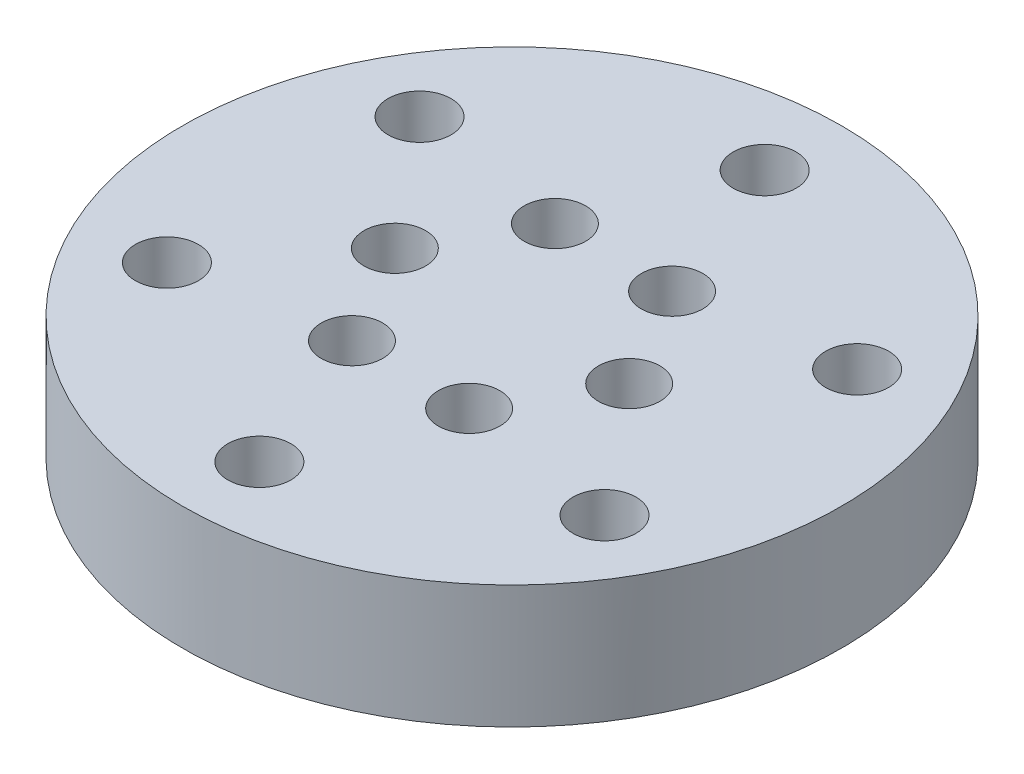
ISO-10303-21;
HEADER;
FILE_DESCRIPTION(('STEP AP214'),'2;1');
FILE_NAME('part.step','',(''),(''),'','','');
FILE_SCHEMA(('AUTOMOTIVE_DESIGN { 1 0 10303 214 1 1 1 1 }'));
ENDSEC;
DATA;
#1=APPLICATION_CONTEXT('core data for automotive mechanical design processes');
#2=APPLICATION_PROTOCOL_DEFINITION('international standard','automotive_design',2000,#1);
#3=PRODUCT_CONTEXT('',#1,'mechanical');
#4=PRODUCT('Part','Part','',(#3));
#5=PRODUCT_RELATED_PRODUCT_CATEGORY('part','',(#4));
#6=PRODUCT_DEFINITION_FORMATION('','',#4);
#7=PRODUCT_DEFINITION_CONTEXT('part definition',#1,'design');
#8=PRODUCT_DEFINITION('design','',#6,#7);
#9=PRODUCT_DEFINITION_SHAPE('','',#8);
#10=(LENGTH_UNIT() NAMED_UNIT(*) SI_UNIT(.MILLI.,.METRE.));
#11=(NAMED_UNIT(*) PLANE_ANGLE_UNIT() SI_UNIT($,.RADIAN.));
#12=(NAMED_UNIT(*) SI_UNIT($,.STERADIAN.) SOLID_ANGLE_UNIT());
#13=UNCERTAINTY_MEASURE_WITH_UNIT(LENGTH_MEASURE(1.E-05),#10,'distance_accuracy_value','');
#14=(GEOMETRIC_REPRESENTATION_CONTEXT(3) GLOBAL_UNCERTAINTY_ASSIGNED_CONTEXT((#13)) GLOBAL_UNIT_ASSIGNED_CONTEXT((#10,
#11,#12)) REPRESENTATION_CONTEXT('',''));
#15=CARTESIAN_POINT('',(0.,0.,0.));
#16=DIRECTION('',(0.,0.,1.));
#17=DIRECTION('',(1.,0.,0.));
#18=AXIS2_PLACEMENT_3D('',#15,#16,#17);
#19=CARTESIAN_POINT('',(0.,10.4,0.));
#20=DIRECTION('',(0.,-1.,0.));
#21=DIRECTION('',(0.,0.,-1.));
#22=AXIS2_PLACEMENT_3D('',#19,#20,#21);
#23=CYLINDRICAL_SURFACE('',#22,22.5);
#24=CARTESIAN_POINT('',(0.,10.4,0.));
#25=DIRECTION('',(0.,1.,0.));
#26=DIRECTION('',(0.,0.,1.));
#27=AXIS2_PLACEMENT_3D('',#24,#25,#26);
#28=CIRCLE('',#27,22.5);
#29=CARTESIAN_POINT('',(0.,10.4,22.5));
#30=VERTEX_POINT('',#29);
#31=EDGE_CURVE('E10',#30,#30,#28,.T.);
#32=ORIENTED_EDGE('',*,*,#31,.F.);
#33=EDGE_LOOP('',(#32));
#34=FACE_BOUND('',#33,.T.);
#35=CARTESIAN_POINT('',(0.,2.,0.));
#36=DIRECTION('',(0.,-1.,0.));
#37=DIRECTION('',(0.,0.,-1.));
#38=AXIS2_PLACEMENT_3D('',#35,#36,#37);
#39=CIRCLE('',#38,22.5);
#40=CARTESIAN_POINT('',(0.,2.,-22.5));
#41=VERTEX_POINT('',#40);
#42=EDGE_CURVE('E154',#41,#41,#39,.T.);
#43=ORIENTED_EDGE('',*,*,#42,.F.);
#44=EDGE_LOOP('',(#43));
#45=FACE_BOUND('',#44,.T.);
#46=ADVANCED_FACE('F39',(#34,#45),#23,.T.);
#47=CARTESIAN_POINT('',(-14.9389382152816,5.,-8.62499999999986));
#48=DIRECTION('',(0.,-1.,0.));
#49=DIRECTION('',(0.,0.,-1.));
#50=AXIS2_PLACEMENT_3D('',#47,#48,#49);
#51=CYLINDRICAL_SURFACE('',#50,4.);
#52=CARTESIAN_POINT('',(-14.9389382152816,5.,-8.62499999999986));
#53=DIRECTION('',(0.,-1.,0.));
#54=DIRECTION('',(0.,0.,-1.));
#55=AXIS2_PLACEMENT_3D('',#52,#53,#54);
#56=CIRCLE('',#55,4.);
#57=CARTESIAN_POINT('',(-14.9389382152816,5.,-12.6249999999999));
#58=VERTEX_POINT('',#57);
#59=EDGE_CURVE('E72',#58,#58,#56,.T.);
#60=ORIENTED_EDGE('',*,*,#59,.F.);
#61=EDGE_LOOP('',(#60));
#62=FACE_BOUND('',#61,.T.);
#63=CARTESIAN_POINT('',(-14.9389382152816,2.,-8.62499999999986));
#64=DIRECTION('',(0.,-1.,0.));
#65=DIRECTION('',(0.,0.,-1.));
#66=AXIS2_PLACEMENT_3D('',#63,#64,#65);
#67=CIRCLE('',#66,4.);
#68=CARTESIAN_POINT('',(-14.9389382152816,2.,-12.6249999999999));
#69=VERTEX_POINT('',#68);
#70=EDGE_CURVE('E121',#69,#69,#67,.F.);
#71=ORIENTED_EDGE('',*,*,#70,.F.);
#72=EDGE_LOOP('',(#71));
#73=FACE_BOUND('',#72,.T.);
#74=ADVANCED_FACE('F184',(#62,#73),#51,.F.);
#75=CARTESIAN_POINT('',(-14.9389382152815,5.,8.62500000000017));
#76=DIRECTION('',(0.,-1.,0.));
#77=DIRECTION('',(0.,0.,-1.));
#78=AXIS2_PLACEMENT_3D('',#75,#76,#77);
#79=CYLINDRICAL_SURFACE('',#78,4.);
#80=CARTESIAN_POINT('',(-14.9389382152815,5.,8.62500000000017));
#81=DIRECTION('',(0.,-1.,0.));
#82=DIRECTION('',(0.,0.,-1.));
#83=AXIS2_PLACEMENT_3D('',#80,#81,#82);
#84=CIRCLE('',#83,4.);
#85=CARTESIAN_POINT('',(-14.9389382152815,5.,4.62500000000017));
#86=VERTEX_POINT('',#85);
#87=EDGE_CURVE('E96',#86,#86,#84,.T.);
#88=ORIENTED_EDGE('',*,*,#87,.F.);
#89=EDGE_LOOP('',(#88));
#90=FACE_BOUND('',#89,.T.);
#91=CARTESIAN_POINT('',(-14.9389382152815,2.,8.62500000000017));
#92=DIRECTION('',(0.,-1.,0.));
#93=DIRECTION('',(0.,0.,-1.));
#94=AXIS2_PLACEMENT_3D('',#91,#92,#93);
#95=CIRCLE('',#94,4.);
#96=CARTESIAN_POINT('',(-14.9389382152815,2.,4.62500000000017));
#97=VERTEX_POINT('',#96);
#98=EDGE_CURVE('E124',#97,#97,#95,.F.);
#99=ORIENTED_EDGE('',*,*,#98,.F.);
#100=EDGE_LOOP('',(#99));
#101=FACE_BOUND('',#100,.T.);
#102=ADVANCED_FACE('F190',(#90,#101),#79,.F.);
#103=CARTESIAN_POINT('',(0.,5.,17.25));
#104=DIRECTION('',(0.,-1.,0.));
#105=DIRECTION('',(0.,0.,-1.));
#106=AXIS2_PLACEMENT_3D('',#103,#104,#105);
#107=CYLINDRICAL_SURFACE('',#106,4.);
#108=CARTESIAN_POINT('',(0.,5.,17.25));
#109=DIRECTION('',(0.,-1.,0.));
#110=DIRECTION('',(0.,0.,-1.));
#111=AXIS2_PLACEMENT_3D('',#108,#109,#110);
#112=CIRCLE('',#111,4.);
#113=CARTESIAN_POINT('',(0.,5.,13.25));
#114=VERTEX_POINT('',#113);
#115=EDGE_CURVE('E67',#114,#114,#112,.T.);
#116=ORIENTED_EDGE('',*,*,#115,.F.);
#117=EDGE_LOOP('',(#116));
#118=FACE_BOUND('',#117,.T.);
#119=CARTESIAN_POINT('',(0.,2.,17.25));
#120=DIRECTION('',(0.,-1.,0.));
#121=DIRECTION('',(0.,0.,-1.));
#122=AXIS2_PLACEMENT_3D('',#119,#120,#121);
#123=CIRCLE('',#122,4.);
#124=CARTESIAN_POINT('',(0.,2.,13.25));
#125=VERTEX_POINT('',#124);
#126=EDGE_CURVE('E127',#125,#125,#123,.F.);
#127=ORIENTED_EDGE('',*,*,#126,.F.);
#128=EDGE_LOOP('',(#127));
#129=FACE_BOUND('',#128,.T.);
#130=ADVANCED_FACE('F197',(#118,#129),#107,.F.);
#131=CARTESIAN_POINT('',(14.9389382152816,5.,8.62499999999999));
#132=DIRECTION('',(0.,-1.,0.));
#133=DIRECTION('',(0.,0.,-1.));
#134=AXIS2_PLACEMENT_3D('',#131,#132,#133);
#135=CYLINDRICAL_SURFACE('',#134,4.00000000000003);
#136=CARTESIAN_POINT('',(14.9389382152816,5.,8.62499999999999));
#137=DIRECTION('',(0.,-1.,0.));
#138=DIRECTION('',(0.,0.,-1.));
#139=AXIS2_PLACEMENT_3D('',#136,#137,#138);
#140=CIRCLE('',#139,4.00000000000003);
#141=CARTESIAN_POINT('',(14.9389382152816,5.,4.62499999999996));
#142=VERTEX_POINT('',#141);
#143=EDGE_CURVE('E85',#142,#142,#140,.T.);
#144=ORIENTED_EDGE('',*,*,#143,.F.);
#145=EDGE_LOOP('',(#144));
#146=FACE_BOUND('',#145,.T.);
#147=CARTESIAN_POINT('',(14.9389382152816,2.,8.62499999999999));
#148=DIRECTION('',(0.,-1.,0.));
#149=DIRECTION('',(0.,0.,-1.));
#150=AXIS2_PLACEMENT_3D('',#147,#148,#149);
#151=CIRCLE('',#150,4.00000000000003);
#152=CARTESIAN_POINT('',(14.9389382152816,2.,4.62499999999996));
#153=VERTEX_POINT('',#152);
#154=EDGE_CURVE('E130',#153,#153,#151,.F.);
#155=ORIENTED_EDGE('',*,*,#154,.F.);
#156=EDGE_LOOP('',(#155));
#157=FACE_BOUND('',#156,.T.);
#158=ADVANCED_FACE('F271',(#146,#157),#135,.F.);
#159=CARTESIAN_POINT('',(14.9389382152815,5.,-8.62500000000007));
#160=DIRECTION('',(0.,-1.,0.));
#161=DIRECTION('',(0.,0.,-1.));
#162=AXIS2_PLACEMENT_3D('',#159,#160,#161);
#163=CYLINDRICAL_SURFACE('',#162,4.);
#164=CARTESIAN_POINT('',(14.9389382152815,5.,-8.62500000000007));
#165=DIRECTION('',(0.,-1.,0.));
#166=DIRECTION('',(0.,0.,-1.));
#167=AXIS2_PLACEMENT_3D('',#164,#165,#166);
#168=CIRCLE('',#167,4.);
#169=CARTESIAN_POINT('',(14.9389382152815,5.,-12.6250000000001));
#170=VERTEX_POINT('',#169);
#171=EDGE_CURVE('E79',#170,#170,#168,.T.);
#172=ORIENTED_EDGE('',*,*,#171,.F.);
#173=EDGE_LOOP('',(#172));
#174=FACE_BOUND('',#173,.T.);
#175=CARTESIAN_POINT('',(14.9389382152815,2.,-8.62500000000007));
#176=DIRECTION('',(0.,-1.,0.));
#177=DIRECTION('',(0.,0.,-1.));
#178=AXIS2_PLACEMENT_3D('',#175,#176,#177);
#179=CIRCLE('',#178,4.);
#180=CARTESIAN_POINT('',(14.9389382152815,2.,-12.6250000000001));
#181=VERTEX_POINT('',#180);
#182=EDGE_CURVE('E133',#181,#181,#179,.F.);
#183=ORIENTED_EDGE('',*,*,#182,.F.);
#184=EDGE_LOOP('',(#183));
#185=FACE_BOUND('',#184,.T.);
#186=ADVANCED_FACE('F312',(#174,#185),#163,.F.);
#187=CARTESIAN_POINT('',(-1.22190829666065E-13,5.,-17.25));
#188=DIRECTION('',(0.,-1.,0.));
#189=DIRECTION('',(0.,0.,-1.));
#190=AXIS2_PLACEMENT_3D('',#187,#188,#189);
#191=CYLINDRICAL_SURFACE('',#190,4.);
#192=CARTESIAN_POINT('',(-1.22190829666065E-13,5.,-17.25));
#193=DIRECTION('',(0.,-1.,0.));
#194=DIRECTION('',(0.,0.,-1.));
#195=AXIS2_PLACEMENT_3D('',#192,#193,#194);
#196=CIRCLE('',#195,4.);
#197=CARTESIAN_POINT('',(-1.22190829666065E-13,5.,-21.25));
#198=VERTEX_POINT('',#197);
#199=EDGE_CURVE('E71',#198,#198,#196,.T.);
#200=ORIENTED_EDGE('',*,*,#199,.F.);
#201=EDGE_LOOP('',(#200));
#202=FACE_BOUND('',#201,.T.);
#203=CARTESIAN_POINT('',(-1.22190829666065E-13,2.,-17.25));
#204=DIRECTION('',(0.,-1.,0.));
#205=DIRECTION('',(0.,0.,-1.));
#206=AXIS2_PLACEMENT_3D('',#203,#204,#205);
#207=CIRCLE('',#206,4.);
#208=CARTESIAN_POINT('',(-1.22190829666065E-13,2.,-21.25));
#209=VERTEX_POINT('',#208);
#210=EDGE_CURVE('E136',#209,#209,#207,.F.);
#211=ORIENTED_EDGE('',*,*,#210,.F.);
#212=EDGE_LOOP('',(#211));
#213=FACE_BOUND('',#212,.T.);
#214=ADVANCED_FACE('F296',(#202,#213),#191,.F.);
#215=CARTESIAN_POINT('',(8.,10.4,0.));
#216=DIRECTION('',(0.,-1.,0.));
#217=DIRECTION('',(0.,0.,-1.));
#218=AXIS2_PLACEMENT_3D('',#215,#216,#217);
#219=CYLINDRICAL_SURFACE('',#218,2.1);
#220=CARTESIAN_POINT('',(8.,10.4,0.));
#221=DIRECTION('',(0.,-1.,0.));
#222=DIRECTION('',(0.,0.,-1.));
#223=AXIS2_PLACEMENT_3D('',#220,#221,#222);
#224=CIRCLE('',#223,2.1);
#225=CARTESIAN_POINT('',(8.,10.4,-2.10000000000001));
#226=VERTEX_POINT('',#225);
#227=EDGE_CURVE('E99',#226,#226,#224,.T.);
#228=ORIENTED_EDGE('',*,*,#227,.F.);
#229=EDGE_LOOP('',(#228));
#230=FACE_BOUND('',#229,.T.);
#231=CARTESIAN_POINT('',(8.,2.,0.));
#232=DIRECTION('',(0.,-1.,0.));
#233=DIRECTION('',(0.,0.,-1.));
#234=AXIS2_PLACEMENT_3D('',#231,#232,#233);
#235=CIRCLE('',#234,2.1);
#236=CARTESIAN_POINT('',(8.,2.,-2.10000000000001));
#237=VERTEX_POINT('',#236);
#238=EDGE_CURVE('E139',#237,#237,#235,.F.);
#239=ORIENTED_EDGE('',*,*,#238,.F.);
#240=EDGE_LOOP('',(#239));
#241=FACE_BOUND('',#240,.T.);
#242=ADVANCED_FACE('F288',(#230,#241),#219,.F.);
#243=CARTESIAN_POINT('',(3.99999999999999,10.4,-6.92820323027551));
#244=DIRECTION('',(0.,-1.,0.));
#245=DIRECTION('',(0.,0.,-1.));
#246=AXIS2_PLACEMENT_3D('',#243,#244,#245);
#247=CYLINDRICAL_SURFACE('',#246,2.1);
#248=CARTESIAN_POINT('',(3.99999999999999,10.4,-6.92820323027551));
#249=DIRECTION('',(0.,-1.,0.));
#250=DIRECTION('',(0.,0.,-1.));
#251=AXIS2_PLACEMENT_3D('',#248,#249,#250);
#252=CIRCLE('',#251,2.1);
#253=CARTESIAN_POINT('',(3.99999999999999,10.4,-9.02820323027551));
#254=VERTEX_POINT('',#253);
#255=EDGE_CURVE('E111',#254,#254,#252,.T.);
#256=ORIENTED_EDGE('',*,*,#255,.F.);
#257=EDGE_LOOP('',(#256));
#258=FACE_BOUND('',#257,.T.);
#259=CARTESIAN_POINT('',(3.99999999999999,2.,-6.92820323027551));
#260=DIRECTION('',(0.,-1.,0.));
#261=DIRECTION('',(0.,0.,-1.));
#262=AXIS2_PLACEMENT_3D('',#259,#260,#261);
#263=CIRCLE('',#262,2.1);
#264=CARTESIAN_POINT('',(3.99999999999999,2.,-9.02820323027551));
#265=VERTEX_POINT('',#264);
#266=EDGE_CURVE('E142',#265,#265,#263,.F.);
#267=ORIENTED_EDGE('',*,*,#266,.F.);
#268=EDGE_LOOP('',(#267));
#269=FACE_BOUND('',#268,.T.);
#270=ADVANCED_FACE('F285',(#258,#269),#247,.F.);
#271=CARTESIAN_POINT('',(-4.00000000000001,10.4,-6.9282032302755));
#272=DIRECTION('',(0.,-1.,0.));
#273=DIRECTION('',(0.,0.,-1.));
#274=AXIS2_PLACEMENT_3D('',#271,#272,#273);
#275=CYLINDRICAL_SURFACE('',#274,2.1);
#276=CARTESIAN_POINT('',(-4.00000000000001,10.4,-6.9282032302755));
#277=DIRECTION('',(0.,-1.,0.));
#278=DIRECTION('',(0.,0.,-1.));
#279=AXIS2_PLACEMENT_3D('',#276,#277,#278);
#280=CIRCLE('',#279,2.1);
#281=CARTESIAN_POINT('',(-4.00000000000001,10.4,-9.0282032302755));
#282=VERTEX_POINT('',#281);
#283=EDGE_CURVE('E107',#282,#282,#280,.T.);
#284=ORIENTED_EDGE('',*,*,#283,.F.);
#285=EDGE_LOOP('',(#284));
#286=FACE_BOUND('',#285,.T.);
#287=CARTESIAN_POINT('',(-4.00000000000001,2.,-6.9282032302755));
#288=DIRECTION('',(0.,-1.,0.));
#289=DIRECTION('',(0.,0.,-1.));
#290=AXIS2_PLACEMENT_3D('',#287,#288,#289);
#291=CIRCLE('',#290,2.1);
#292=CARTESIAN_POINT('',(-4.00000000000001,2.,-9.0282032302755));
#293=VERTEX_POINT('',#292);
#294=EDGE_CURVE('E145',#293,#293,#291,.F.);
#295=ORIENTED_EDGE('',*,*,#294,.F.);
#296=EDGE_LOOP('',(#295));
#297=FACE_BOUND('',#296,.T.);
#298=ADVANCED_FACE('F287',(#286,#297),#275,.F.);
#299=CARTESIAN_POINT('',(-8.,10.4,0.));
#300=DIRECTION('',(0.,-1.,0.));
#301=DIRECTION('',(0.,0.,-1.));
#302=AXIS2_PLACEMENT_3D('',#299,#300,#301);
#303=CYLINDRICAL_SURFACE('',#302,2.1);
#304=CARTESIAN_POINT('',(-8.,10.4,0.));
#305=DIRECTION('',(0.,-1.,0.));
#306=DIRECTION('',(0.,0.,-1.));
#307=AXIS2_PLACEMENT_3D('',#304,#305,#306);
#308=CIRCLE('',#307,2.1);
#309=CARTESIAN_POINT('',(-8.,10.4,-2.09999999999999));
#310=VERTEX_POINT('',#309);
#311=EDGE_CURVE('E110',#310,#310,#308,.T.);
#312=ORIENTED_EDGE('',*,*,#311,.F.);
#313=EDGE_LOOP('',(#312));
#314=FACE_BOUND('',#313,.T.);
#315=CARTESIAN_POINT('',(-8.,2.,0.));
#316=DIRECTION('',(0.,-1.,0.));
#317=DIRECTION('',(0.,0.,-1.));
#318=AXIS2_PLACEMENT_3D('',#315,#316,#317);
#319=CIRCLE('',#318,2.1);
#320=CARTESIAN_POINT('',(-8.,2.,-2.09999999999999));
#321=VERTEX_POINT('',#320);
#322=EDGE_CURVE('E148',#321,#321,#319,.F.);
#323=ORIENTED_EDGE('',*,*,#322,.F.);
#324=EDGE_LOOP('',(#323));
#325=FACE_BOUND('',#324,.T.);
#326=ADVANCED_FACE('F178',(#314,#325),#303,.F.);
#327=CARTESIAN_POINT('',(-3.99999999999999,10.4,6.92820323027551));
#328=DIRECTION('',(0.,-1.,0.));
#329=DIRECTION('',(0.,0.,-1.));
#330=AXIS2_PLACEMENT_3D('',#327,#328,#329);
#331=CYLINDRICAL_SURFACE('',#330,2.1);
#332=CARTESIAN_POINT('',(-3.99999999999999,10.4,6.92820323027551));
#333=DIRECTION('',(0.,-1.,0.));
#334=DIRECTION('',(0.,0.,-1.));
#335=AXIS2_PLACEMENT_3D('',#332,#333,#334);
#336=CIRCLE('',#335,2.1);
#337=CARTESIAN_POINT('',(-3.99999999999999,10.4,4.82820323027551));
#338=VERTEX_POINT('',#337);
#339=EDGE_CURVE('E114',#338,#338,#336,.T.);
#340=ORIENTED_EDGE('',*,*,#339,.F.);
#341=EDGE_LOOP('',(#340));
#342=FACE_BOUND('',#341,.T.);
#343=CARTESIAN_POINT('',(-3.99999999999999,2.,6.92820323027551));
#344=DIRECTION('',(0.,-1.,0.));
#345=DIRECTION('',(0.,0.,-1.));
#346=AXIS2_PLACEMENT_3D('',#343,#344,#345);
#347=CIRCLE('',#346,2.1);
#348=CARTESIAN_POINT('',(-3.99999999999999,2.,4.82820323027551));
#349=VERTEX_POINT('',#348);
#350=EDGE_CURVE('E151',#349,#349,#347,.F.);
#351=ORIENTED_EDGE('',*,*,#350,.F.);
#352=EDGE_LOOP('',(#351));
#353=FACE_BOUND('',#352,.T.);
#354=ADVANCED_FACE('F167',(#342,#353),#331,.F.);
#355=CARTESIAN_POINT('',(4.00000000000001,10.4,6.9282032302755));
#356=DIRECTION('',(0.,-1.,0.));
#357=DIRECTION('',(0.,0.,-1.));
#358=AXIS2_PLACEMENT_3D('',#355,#356,#357);
#359=CYLINDRICAL_SURFACE('',#358,2.1);
#360=CARTESIAN_POINT('',(4.00000000000001,10.4,6.9282032302755));
#361=DIRECTION('',(0.,-1.,0.));
#362=DIRECTION('',(0.,0.,-1.));
#363=AXIS2_PLACEMENT_3D('',#360,#361,#362);
#364=CIRCLE('',#363,2.1);
#365=CARTESIAN_POINT('',(4.00000000000001,10.4,4.8282032302755));
#366=VERTEX_POINT('',#365);
#367=EDGE_CURVE('E106',#366,#366,#364,.T.);
#368=ORIENTED_EDGE('',*,*,#367,.F.);
#369=EDGE_LOOP('',(#368));
#370=FACE_BOUND('',#369,.T.);
#371=CARTESIAN_POINT('',(4.00000000000001,2.,6.9282032302755));
#372=DIRECTION('',(0.,-1.,0.));
#373=DIRECTION('',(0.,0.,-1.));
#374=AXIS2_PLACEMENT_3D('',#371,#372,#373);
#375=CIRCLE('',#374,2.1);
#376=CARTESIAN_POINT('',(4.00000000000001,2.,4.8282032302755));
#377=VERTEX_POINT('',#376);
#378=EDGE_CURVE('E42',#377,#377,#375,.F.);
#379=ORIENTED_EDGE('',*,*,#378,.F.);
#380=EDGE_LOOP('',(#379));
#381=FACE_BOUND('',#380,.T.);
#382=ADVANCED_FACE('F164',(#370,#381),#359,.F.);
#383=CARTESIAN_POINT('',(0.,10.4,-17.25));
#384=DIRECTION('',(0.,-1.,0.));
#385=DIRECTION('',(0.,0.,-1.));
#386=AXIS2_PLACEMENT_3D('',#383,#384,#385);
#387=CYLINDRICAL_SURFACE('',#386,2.15);
#388=CARTESIAN_POINT('',(0.,10.4,-17.25));
#389=DIRECTION('',(0.,1.,0.));
#390=DIRECTION('',(0.,0.,1.));
#391=AXIS2_PLACEMENT_3D('',#388,#389,#390);
#392=CIRCLE('',#391,2.15);
#393=CARTESIAN_POINT('',(0.,10.4,-15.1));
#394=VERTEX_POINT('',#393);
#395=EDGE_CURVE('E46',#394,#394,#392,.T.);
#396=ORIENTED_EDGE('',*,*,#395,.T.);
#397=EDGE_LOOP('',(#396));
#398=FACE_BOUND('',#397,.T.);
#399=CARTESIAN_POINT('',(0.,5.,-17.25));
#400=DIRECTION('',(0.,-1.,0.));
#401=DIRECTION('',(0.,0.,-1.));
#402=AXIS2_PLACEMENT_3D('',#399,#400,#401);
#403=CIRCLE('',#402,2.15);
#404=CARTESIAN_POINT('',(0.,5.,-19.4));
#405=VERTEX_POINT('',#404);
#406=EDGE_CURVE('E76',#405,#405,#403,.T.);
#407=ORIENTED_EDGE('',*,*,#406,.T.);
#408=EDGE_LOOP('',(#407));
#409=FACE_BOUND('',#408,.T.);
#410=ADVANCED_FACE('F166',(#398,#409),#387,.F.);
#411=CARTESIAN_POINT('',(14.9389382152816,10.4,-8.625));
#412=DIRECTION('',(0.,-1.,0.));
#413=DIRECTION('',(0.,0.,-1.));
#414=AXIS2_PLACEMENT_3D('',#411,#412,#413);
#415=CYLINDRICAL_SURFACE('',#414,2.15);
#416=CARTESIAN_POINT('',(14.9389382152816,10.4,-8.625));
#417=DIRECTION('',(0.,1.,0.));
#418=DIRECTION('',(0.,0.,1.));
#419=AXIS2_PLACEMENT_3D('',#416,#417,#418);
#420=CIRCLE('',#419,2.15);
#421=CARTESIAN_POINT('',(14.9389382152816,10.4,-6.47500000000001));
#422=VERTEX_POINT('',#421);
#423=EDGE_CURVE('E50',#422,#422,#420,.T.);
#424=ORIENTED_EDGE('',*,*,#423,.T.);
#425=EDGE_LOOP('',(#424));
#426=FACE_BOUND('',#425,.T.);
#427=CARTESIAN_POINT('',(14.9389382152816,5.,-8.625));
#428=DIRECTION('',(0.,-1.,0.));
#429=DIRECTION('',(0.,0.,-1.));
#430=AXIS2_PLACEMENT_3D('',#427,#428,#429);
#431=CIRCLE('',#430,2.15);
#432=CARTESIAN_POINT('',(14.9389382152816,5.,-10.775));
#433=VERTEX_POINT('',#432);
#434=EDGE_CURVE('E82',#433,#433,#431,.T.);
#435=ORIENTED_EDGE('',*,*,#434,.T.);
#436=EDGE_LOOP('',(#435));
#437=FACE_BOUND('',#436,.T.);
#438=ADVANCED_FACE('F175',(#426,#437),#415,.F.);
#439=CARTESIAN_POINT('',(14.9389382152816,10.4,8.62499999999999));
#440=DIRECTION('',(0.,-1.,0.));
#441=DIRECTION('',(0.,0.,-1.));
#442=AXIS2_PLACEMENT_3D('',#439,#440,#441);
#443=CYLINDRICAL_SURFACE('',#442,2.15);
#444=CARTESIAN_POINT('',(14.9389382152816,10.4,8.62499999999999));
#445=DIRECTION('',(0.,1.,0.));
#446=DIRECTION('',(0.,0.,1.));
#447=AXIS2_PLACEMENT_3D('',#444,#445,#446);
#448=CIRCLE('',#447,2.15);
#449=CARTESIAN_POINT('',(14.9389382152816,10.4,10.775));
#450=VERTEX_POINT('',#449);
#451=EDGE_CURVE('E55',#450,#450,#448,.T.);
#452=ORIENTED_EDGE('',*,*,#451,.T.);
#453=EDGE_LOOP('',(#452));
#454=FACE_BOUND('',#453,.T.);
#455=CARTESIAN_POINT('',(14.9389382152816,5.,8.62499999999999));
#456=DIRECTION('',(0.,-1.,0.));
#457=DIRECTION('',(0.,0.,-1.));
#458=AXIS2_PLACEMENT_3D('',#455,#456,#457);
#459=CIRCLE('',#458,2.15);
#460=CARTESIAN_POINT('',(14.9389382152816,5.,6.475));
#461=VERTEX_POINT('',#460);
#462=EDGE_CURVE('E88',#461,#461,#459,.T.);
#463=ORIENTED_EDGE('',*,*,#462,.T.);
#464=EDGE_LOOP('',(#463));
#465=FACE_BOUND('',#464,.T.);
#466=ADVANCED_FACE('F223',(#454,#465),#443,.F.);
#467=CARTESIAN_POINT('',(0.,10.4,17.25));
#468=DIRECTION('',(0.,-1.,0.));
#469=DIRECTION('',(0.,0.,-1.));
#470=AXIS2_PLACEMENT_3D('',#467,#468,#469);
#471=CYLINDRICAL_SURFACE('',#470,2.15);
#472=CARTESIAN_POINT('',(0.,10.4,17.25));
#473=DIRECTION('',(0.,1.,0.));
#474=DIRECTION('',(0.,0.,1.));
#475=AXIS2_PLACEMENT_3D('',#472,#473,#474);
#476=CIRCLE('',#475,2.15);
#477=CARTESIAN_POINT('',(0.,10.4,19.4));
#478=VERTEX_POINT('',#477);
#479=EDGE_CURVE('E58',#478,#478,#476,.T.);
#480=ORIENTED_EDGE('',*,*,#479,.T.);
#481=EDGE_LOOP('',(#480));
#482=FACE_BOUND('',#481,.T.);
#483=CARTESIAN_POINT('',(0.,5.,17.25));
#484=DIRECTION('',(0.,-1.,0.));
#485=DIRECTION('',(0.,0.,-1.));
#486=AXIS2_PLACEMENT_3D('',#483,#484,#485);
#487=CIRCLE('',#486,2.15);
#488=CARTESIAN_POINT('',(0.,5.,15.1));
#489=VERTEX_POINT('',#488);
#490=EDGE_CURVE('E91',#489,#489,#487,.T.);
#491=ORIENTED_EDGE('',*,*,#490,.T.);
#492=EDGE_LOOP('',(#491));
#493=FACE_BOUND('',#492,.T.);
#494=ADVANCED_FACE('F219',(#482,#493),#471,.F.);
#495=CARTESIAN_POINT('',(-14.9389382152816,10.4,8.62500000000001));
#496=DIRECTION('',(0.,-1.,0.));
#497=DIRECTION('',(0.,0.,-1.));
#498=AXIS2_PLACEMENT_3D('',#495,#496,#497);
#499=CYLINDRICAL_SURFACE('',#498,2.15);
#500=CARTESIAN_POINT('',(-14.9389382152816,10.4,8.62500000000001));
#501=DIRECTION('',(0.,1.,0.));
#502=DIRECTION('',(0.,0.,1.));
#503=AXIS2_PLACEMENT_3D('',#500,#501,#502);
#504=CIRCLE('',#503,2.15);
#505=CARTESIAN_POINT('',(-14.9389382152816,10.4,10.775));
#506=VERTEX_POINT('',#505);
#507=EDGE_CURVE('E61',#506,#506,#504,.T.);
#508=ORIENTED_EDGE('',*,*,#507,.T.);
#509=EDGE_LOOP('',(#508));
#510=FACE_BOUND('',#509,.T.);
#511=CARTESIAN_POINT('',(-14.9389382152816,5.,8.62500000000001));
#512=DIRECTION('',(0.,-1.,0.));
#513=DIRECTION('',(0.,0.,-1.));
#514=AXIS2_PLACEMENT_3D('',#511,#512,#513);
#515=CIRCLE('',#514,2.15);
#516=CARTESIAN_POINT('',(-14.9389382152816,5.,6.475));
#517=VERTEX_POINT('',#516);
#518=EDGE_CURVE('E75',#517,#517,#515,.T.);
#519=ORIENTED_EDGE('',*,*,#518,.T.);
#520=EDGE_LOOP('',(#519));
#521=FACE_BOUND('',#520,.T.);
#522=ADVANCED_FACE('F215',(#510,#521),#499,.F.);
#523=CARTESIAN_POINT('',(-14.9389382152816,10.4,-8.62499999999999));
#524=DIRECTION('',(0.,-1.,0.));
#525=DIRECTION('',(0.,0.,-1.));
#526=AXIS2_PLACEMENT_3D('',#523,#524,#525);
#527=CYLINDRICAL_SURFACE('',#526,2.15);
#528=CARTESIAN_POINT('',(-14.9389382152816,10.4,-8.62499999999999));
#529=DIRECTION('',(0.,1.,0.));
#530=DIRECTION('',(0.,0.,1.));
#531=AXIS2_PLACEMENT_3D('',#528,#529,#530);
#532=CIRCLE('',#531,2.15);
#533=CARTESIAN_POINT('',(-14.9389382152816,10.4,-6.47499999999999));
#534=VERTEX_POINT('',#533);
#535=EDGE_CURVE('E64',#534,#534,#532,.T.);
#536=ORIENTED_EDGE('',*,*,#535,.T.);
#537=EDGE_LOOP('',(#536));
#538=FACE_BOUND('',#537,.T.);
#539=CARTESIAN_POINT('',(-14.9389382152816,5.,-8.62499999999999));
#540=DIRECTION('',(0.,-1.,0.));
#541=DIRECTION('',(0.,0.,-1.));
#542=AXIS2_PLACEMENT_3D('',#539,#540,#541);
#543=CIRCLE('',#542,2.15);
#544=CARTESIAN_POINT('',(-14.9389382152816,5.,-10.775));
#545=VERTEX_POINT('',#544);
#546=EDGE_CURVE('E68',#545,#545,#543,.T.);
#547=ORIENTED_EDGE('',*,*,#546,.T.);
#548=EDGE_LOOP('',(#547));
#549=FACE_BOUND('',#548,.T.);
#550=ADVANCED_FACE('F212',(#538,#549),#527,.F.);
#551=CARTESIAN_POINT('',(0.,10.4,0.));
#552=DIRECTION('',(0.,1.,0.));
#553=DIRECTION('',(0.,0.,1.));
#554=AXIS2_PLACEMENT_3D('',#551,#552,#553);
#555=PLANE('',#554);
#556=ORIENTED_EDGE('',*,*,#367,.T.);
#557=EDGE_LOOP('',(#556));
#558=FACE_BOUND('',#557,.T.);
#559=ORIENTED_EDGE('',*,*,#339,.T.);
#560=EDGE_LOOP('',(#559));
#561=FACE_BOUND('',#560,.T.);
#562=ORIENTED_EDGE('',*,*,#311,.T.);
#563=EDGE_LOOP('',(#562));
#564=FACE_BOUND('',#563,.T.);
#565=ORIENTED_EDGE('',*,*,#283,.T.);
#566=EDGE_LOOP('',(#565));
#567=FACE_BOUND('',#566,.T.);
#568=ORIENTED_EDGE('',*,*,#255,.T.);
#569=EDGE_LOOP('',(#568));
#570=FACE_BOUND('',#569,.T.);
#571=ORIENTED_EDGE('',*,*,#227,.T.);
#572=EDGE_LOOP('',(#571));
#573=FACE_BOUND('',#572,.T.);
#574=ORIENTED_EDGE('',*,*,#507,.F.);
#575=EDGE_LOOP('',(#574));
#576=FACE_BOUND('',#575,.T.);
#577=ORIENTED_EDGE('',*,*,#451,.F.);
#578=EDGE_LOOP('',(#577));
#579=FACE_BOUND('',#578,.T.);
#580=ORIENTED_EDGE('',*,*,#395,.F.);
#581=EDGE_LOOP('',(#580));
#582=FACE_BOUND('',#581,.T.);
#583=ORIENTED_EDGE('',*,*,#31,.T.);
#584=EDGE_LOOP('',(#583));
#585=FACE_BOUND('',#584,.T.);
#586=ORIENTED_EDGE('',*,*,#423,.F.);
#587=EDGE_LOOP('',(#586));
#588=FACE_BOUND('',#587,.T.);
#589=ORIENTED_EDGE('',*,*,#479,.F.);
#590=EDGE_LOOP('',(#589));
#591=FACE_BOUND('',#590,.T.);
#592=ORIENTED_EDGE('',*,*,#535,.F.);
#593=EDGE_LOOP('',(#592));
#594=FACE_BOUND('',#593,.T.);
#595=ADVANCED_FACE('F210',(#558,#561,#564,#567,#570,#573,#576,#579,#582,#585,#588,#591,#594),
#555,.T.);
#596=CARTESIAN_POINT('',(-14.9389382152816,5.,-8.62499999999986));
#597=DIRECTION('',(0.,-1.,0.));
#598=DIRECTION('',(0.,0.,-1.));
#599=AXIS2_PLACEMENT_3D('',#596,#597,#598);
#600=PLANE('',#599);
#601=ORIENTED_EDGE('',*,*,#546,.F.);
#602=EDGE_LOOP('',(#601));
#603=FACE_BOUND('',#602,.T.);
#604=ORIENTED_EDGE('',*,*,#59,.T.);
#605=EDGE_LOOP('',(#604));
#606=FACE_BOUND('',#605,.T.);
#607=ADVANCED_FACE('F206',(#603,#606),#600,.T.);
#608=CARTESIAN_POINT('',(-14.9389382152815,5.,8.62500000000017));
#609=DIRECTION('',(0.,-1.,0.));
#610=DIRECTION('',(0.,0.,-1.));
#611=AXIS2_PLACEMENT_3D('',#608,#609,#610);
#612=PLANE('',#611);
#613=ORIENTED_EDGE('',*,*,#518,.F.);
#614=EDGE_LOOP('',(#613));
#615=FACE_BOUND('',#614,.T.);
#616=ORIENTED_EDGE('',*,*,#87,.T.);
#617=EDGE_LOOP('',(#616));
#618=FACE_BOUND('',#617,.T.);
#619=ADVANCED_FACE('F209',(#615,#618),#612,.T.);
#620=CARTESIAN_POINT('',(0.,5.,17.25));
#621=DIRECTION('',(0.,-1.,0.));
#622=DIRECTION('',(0.,0.,-1.));
#623=AXIS2_PLACEMENT_3D('',#620,#621,#622);
#624=PLANE('',#623);
#625=ORIENTED_EDGE('',*,*,#490,.F.);
#626=EDGE_LOOP('',(#625));
#627=FACE_BOUND('',#626,.T.);
#628=ORIENTED_EDGE('',*,*,#115,.T.);
#629=EDGE_LOOP('',(#628));
#630=FACE_BOUND('',#629,.T.);
#631=ADVANCED_FACE('F262',(#627,#630),#624,.T.);
#632=CARTESIAN_POINT('',(14.9389382152816,5.,8.62499999999999));
#633=DIRECTION('',(0.,-1.,0.));
#634=DIRECTION('',(0.,0.,-1.));
#635=AXIS2_PLACEMENT_3D('',#632,#633,#634);
#636=PLANE('',#635);
#637=ORIENTED_EDGE('',*,*,#462,.F.);
#638=EDGE_LOOP('',(#637));
#639=FACE_BOUND('',#638,.T.);
#640=ORIENTED_EDGE('',*,*,#143,.T.);
#641=EDGE_LOOP('',(#640));
#642=FACE_BOUND('',#641,.T.);
#643=ADVANCED_FACE('F265',(#639,#642),#636,.T.);
#644=CARTESIAN_POINT('',(14.9389382152815,5.,-8.62500000000007));
#645=DIRECTION('',(0.,-1.,0.));
#646=DIRECTION('',(0.,0.,-1.));
#647=AXIS2_PLACEMENT_3D('',#644,#645,#646);
#648=PLANE('',#647);
#649=ORIENTED_EDGE('',*,*,#434,.F.);
#650=EDGE_LOOP('',(#649));
#651=FACE_BOUND('',#650,.T.);
#652=ORIENTED_EDGE('',*,*,#171,.T.);
#653=EDGE_LOOP('',(#652));
#654=FACE_BOUND('',#653,.T.);
#655=ADVANCED_FACE('F283',(#651,#654),#648,.T.);
#656=CARTESIAN_POINT('',(-1.22190829666065E-13,5.,-17.25));
#657=DIRECTION('',(0.,-1.,0.));
#658=DIRECTION('',(0.,0.,-1.));
#659=AXIS2_PLACEMENT_3D('',#656,#657,#658);
#660=PLANE('',#659);
#661=ORIENTED_EDGE('',*,*,#406,.F.);
#662=EDGE_LOOP('',(#661));
#663=FACE_BOUND('',#662,.T.);
#664=ORIENTED_EDGE('',*,*,#199,.T.);
#665=EDGE_LOOP('',(#664));
#666=FACE_BOUND('',#665,.T.);
#667=ADVANCED_FACE('F204',(#663,#666),#660,.T.);
#668=CARTESIAN_POINT('',(0.,2.,0.));
#669=DIRECTION('',(0.,-1.,0.));
#670=DIRECTION('',(0.,0.,-1.));
#671=AXIS2_PLACEMENT_3D('',#668,#669,#670);
#672=PLANE('',#671);
#673=ORIENTED_EDGE('',*,*,#42,.T.);
#674=EDGE_LOOP('',(#673));
#675=FACE_BOUND('',#674,.T.);
#676=ORIENTED_EDGE('',*,*,#378,.T.);
#677=EDGE_LOOP('',(#676));
#678=FACE_BOUND('',#677,.T.);
#679=ORIENTED_EDGE('',*,*,#350,.T.);
#680=EDGE_LOOP('',(#679));
#681=FACE_BOUND('',#680,.T.);
#682=ORIENTED_EDGE('',*,*,#322,.T.);
#683=EDGE_LOOP('',(#682));
#684=FACE_BOUND('',#683,.T.);
#685=ORIENTED_EDGE('',*,*,#294,.T.);
#686=EDGE_LOOP('',(#685));
#687=FACE_BOUND('',#686,.T.);
#688=ORIENTED_EDGE('',*,*,#266,.T.);
#689=EDGE_LOOP('',(#688));
#690=FACE_BOUND('',#689,.T.);
#691=ORIENTED_EDGE('',*,*,#238,.T.);
#692=EDGE_LOOP('',(#691));
#693=FACE_BOUND('',#692,.T.);
#694=ORIENTED_EDGE('',*,*,#210,.T.);
#695=EDGE_LOOP('',(#694));
#696=FACE_BOUND('',#695,.T.);
#697=ORIENTED_EDGE('',*,*,#182,.T.);
#698=EDGE_LOOP('',(#697));
#699=FACE_BOUND('',#698,.T.);
#700=ORIENTED_EDGE('',*,*,#154,.T.);
#701=EDGE_LOOP('',(#700));
#702=FACE_BOUND('',#701,.T.);
#703=ORIENTED_EDGE('',*,*,#126,.T.);
#704=EDGE_LOOP('',(#703));
#705=FACE_BOUND('',#704,.T.);
#706=ORIENTED_EDGE('',*,*,#98,.T.);
#707=EDGE_LOOP('',(#706));
#708=FACE_BOUND('',#707,.T.);
#709=ORIENTED_EDGE('',*,*,#70,.T.);
#710=EDGE_LOOP('',(#709));
#711=FACE_BOUND('',#710,.T.);
#712=ADVANCED_FACE('F161',(#675,#678,#681,#684,#687,#690,#693,#696,#699,#702,#705,#708,#711),
#672,.T.);
#713=CLOSED_SHELL('',(#46,#74,#102,#130,#158,#186,#214,#242,#270,#298,#326,#354,#382,#410,#438,
#466,#494,#522,#550,#595,#607,#619,#631,#643,#655,#667,#712));
#714=MANIFOLD_SOLID_BREP('B2',#713);
#715=ADVANCED_BREP_SHAPE_REPRESENTATION('',(#18,#714),#14);
#716=SHAPE_DEFINITION_REPRESENTATION(#9,#715);
ENDSEC;
END-ISO-10303-21;
